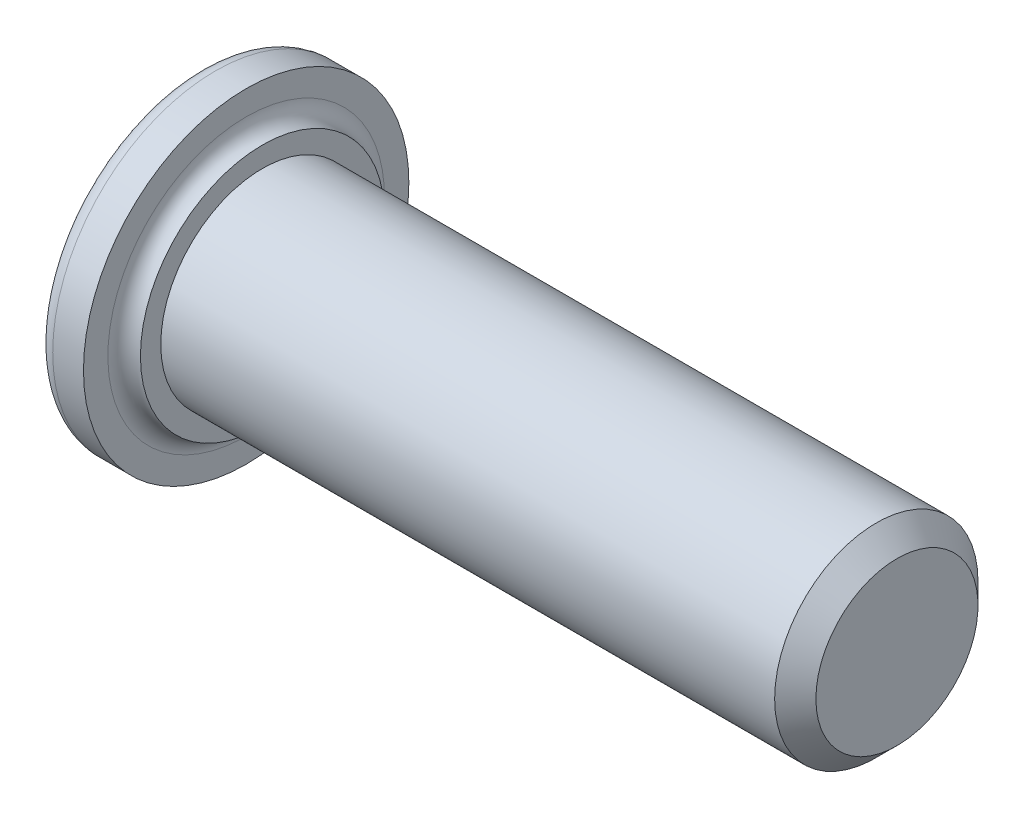
ISO-10303-21;
HEADER;
FILE_DESCRIPTION(('STEP AP214'),'2;1');
FILE_NAME('part.step','',(''),(''),'','','');
FILE_SCHEMA(('AUTOMOTIVE_DESIGN { 1 0 10303 214 1 1 1 1 }'));
ENDSEC;
DATA;
#1=APPLICATION_CONTEXT('core data for automotive mechanical design processes');
#2=APPLICATION_PROTOCOL_DEFINITION('international standard','automotive_design',2000,#1);
#3=PRODUCT_CONTEXT('',#1,'mechanical');
#4=PRODUCT('Part','Part','',(#3));
#5=PRODUCT_RELATED_PRODUCT_CATEGORY('part','',(#4));
#6=PRODUCT_DEFINITION_FORMATION('','',#4);
#7=PRODUCT_DEFINITION_CONTEXT('part definition',#1,'design');
#8=PRODUCT_DEFINITION('design','',#6,#7);
#9=PRODUCT_DEFINITION_SHAPE('','',#8);
#10=(LENGTH_UNIT() NAMED_UNIT(*) SI_UNIT(.MILLI.,.METRE.));
#11=(NAMED_UNIT(*) PLANE_ANGLE_UNIT() SI_UNIT($,.RADIAN.));
#12=(NAMED_UNIT(*) SI_UNIT($,.STERADIAN.) SOLID_ANGLE_UNIT());
#13=UNCERTAINTY_MEASURE_WITH_UNIT(LENGTH_MEASURE(1.E-05),#10,'distance_accuracy_value','');
#14=(GEOMETRIC_REPRESENTATION_CONTEXT(3) GLOBAL_UNCERTAINTY_ASSIGNED_CONTEXT((#13)) GLOBAL_UNIT_ASSIGNED_CONTEXT((#10,
#11,#12)) REPRESENTATION_CONTEXT('',''));
#15=CARTESIAN_POINT('',(0.,0.,0.));
#16=DIRECTION('',(0.,0.,1.));
#17=DIRECTION('',(1.,0.,0.));
#18=AXIS2_PLACEMENT_3D('',#15,#16,#17);
#19=CARTESIAN_POINT('',(-8.,0.,0.));
#20=DIRECTION('',(-1.,0.,0.));
#21=DIRECTION('',(0.,0.,1.));
#22=AXIS2_PLACEMENT_3D('',#19,#20,#21);
#23=PLANE('',#22);
#24=CARTESIAN_POINT('',(-8.,0.,0.));
#25=DIRECTION('',(-1.,0.,0.));
#26=DIRECTION('',(0.,0.,1.));
#27=AXIS2_PLACEMENT_3D('',#24,#25,#26);
#28=CIRCLE('',#27,0.494974746830583);
#29=CARTESIAN_POINT('',(-8.,0.35,0.349999999999998));
#30=VERTEX_POINT('',#29);
#31=CARTESIAN_POINT('',(-8.,0.349999999999998,-0.350000000000001));
#32=VERTEX_POINT('',#31);
#33=EDGE_CURVE('E180',#30,#32,#28,.T.);
#34=ORIENTED_EDGE('',*,*,#33,.F.);
#35=DIRECTION('',(0.,-0.707106781186546,0.707106781186549));
#36=VECTOR('',#35,1.);
#37=CARTESIAN_POINT('',(-8.,0.449999999999998,0.25));
#38=LINE('',#37,#36);
#39=CARTESIAN_POINT('',(-8.,0.449999999999998,0.25));
#40=VERTEX_POINT('',#39);
#41=EDGE_CURVE('E215',#30,#40,#38,.F.);
#42=ORIENTED_EDGE('',*,*,#41,.T.);
#43=DIRECTION('',(0.,1.,0.));
#44=VECTOR('',#43,1.);
#45=CARTESIAN_POINT('',(-8.,1.25,0.25));
#46=LINE('',#45,#44);
#47=CARTESIAN_POINT('',(-8.,1.25,0.25));
#48=VERTEX_POINT('',#47);
#49=EDGE_CURVE('E188',#40,#48,#46,.T.);
#50=ORIENTED_EDGE('',*,*,#49,.T.);
#51=DIRECTION('',(0.,0.,-1.));
#52=VECTOR('',#51,1.);
#53=CARTESIAN_POINT('',(-8.,1.25,-0.25));
#54=LINE('',#53,#52);
#55=CARTESIAN_POINT('',(-8.,1.25,-0.25));
#56=VERTEX_POINT('',#55);
#57=EDGE_CURVE('E437',#48,#56,#54,.T.);
#58=ORIENTED_EDGE('',*,*,#57,.T.);
#59=DIRECTION('',(0.,-1.,0.));
#60=VECTOR('',#59,1.);
#61=CARTESIAN_POINT('',(-8.,1.25,-0.25));
#62=LINE('',#61,#60);
#63=CARTESIAN_POINT('',(-8.,0.45,-0.25));
#64=VERTEX_POINT('',#63);
#65=EDGE_CURVE('E213',#56,#64,#62,.T.);
#66=ORIENTED_EDGE('',*,*,#65,.T.);
#67=DIRECTION('',(0.,0.707106781186551,0.707106781186544));
#68=VECTOR('',#67,1.);
#69=CARTESIAN_POINT('',(-8.,0.249999999999999,-0.449999999999999));
#70=LINE('',#69,#68);
#71=EDGE_CURVE('E205',#64,#32,#70,.F.);
#72=ORIENTED_EDGE('',*,*,#71,.T.);
#73=EDGE_LOOP('',(#34,#42,#50,#58,#66,#72));
#74=FACE_BOUND('',#73,.T.);
#75=ADVANCED_FACE('F45',(#74),#23,.T.);
#76=CARTESIAN_POINT('',(-8.,-0.35,-0.349999999999999));
#77=VERTEX_POINT('',#76);
#78=EDGE_CURVE('E182',#32,#77,#28,.T.);
#79=ORIENTED_EDGE('',*,*,#78,.F.);
#80=CARTESIAN_POINT('',(-8.,0.249999999999999,-0.449999999999999));
#81=VERTEX_POINT('',#80);
#82=EDGE_CURVE('E194',#32,#81,#70,.F.);
#83=ORIENTED_EDGE('',*,*,#82,.T.);
#84=DIRECTION('',(0.,0.,-1.));
#85=VECTOR('',#84,1.);
#86=CARTESIAN_POINT('',(-8.,0.249999999999999,-1.25));
#87=LINE('',#86,#85);
#88=CARTESIAN_POINT('',(-8.,0.249999999999999,-1.25));
#89=VERTEX_POINT('',#88);
#90=EDGE_CURVE('E432',#81,#89,#87,.T.);
#91=ORIENTED_EDGE('',*,*,#90,.T.);
#92=DIRECTION('',(0.,-1.,0.));
#93=VECTOR('',#92,1.);
#94=CARTESIAN_POINT('',(-8.,-0.250000000000001,-1.25));
#95=LINE('',#94,#93);
#96=CARTESIAN_POINT('',(-8.,-0.250000000000001,-1.25));
#97=VERTEX_POINT('',#96);
#98=EDGE_CURVE('E428',#89,#97,#95,.T.);
#99=ORIENTED_EDGE('',*,*,#98,.T.);
#100=DIRECTION('',(0.,0.,1.));
#101=VECTOR('',#100,1.);
#102=CARTESIAN_POINT('',(-8.,-0.250000000000002,-0.25));
#103=LINE('',#102,#101);
#104=CARTESIAN_POINT('',(-8.,-0.250000000000001,-0.449999999999998));
#105=VERTEX_POINT('',#104);
#106=EDGE_CURVE('E425',#97,#105,#103,.T.);
#107=ORIENTED_EDGE('',*,*,#106,.T.);
#108=DIRECTION('',(0.,0.707106781186546,-0.707106781186549));
#109=VECTOR('',#108,1.);
#110=CARTESIAN_POINT('',(-8.,-0.449999999999999,-0.25));
#111=LINE('',#110,#109);
#112=EDGE_CURVE('E198',#105,#77,#111,.F.);
#113=ORIENTED_EDGE('',*,*,#112,.T.);
#114=EDGE_LOOP('',(#79,#83,#91,#99,#107,#113));
#115=FACE_BOUND('',#114,.T.);
#116=ADVANCED_FACE('F193',(#115),#23,.T.);
#117=CARTESIAN_POINT('',(-8.,-0.350000000000002,0.350000000000001));
#118=VERTEX_POINT('',#117);
#119=EDGE_CURVE('E61',#77,#118,#28,.T.);
#120=ORIENTED_EDGE('',*,*,#119,.F.);
#121=CARTESIAN_POINT('',(-8.,-0.449999999999999,-0.25));
#122=VERTEX_POINT('',#121);
#123=EDGE_CURVE('E278',#77,#122,#111,.F.);
#124=ORIENTED_EDGE('',*,*,#123,.T.);
#125=DIRECTION('',(0.,-1.,0.));
#126=VECTOR('',#125,1.);
#127=CARTESIAN_POINT('',(-8.,-1.25,-0.25));
#128=LINE('',#127,#126);
#129=CARTESIAN_POINT('',(-8.,-1.25,-0.25));
#130=VERTEX_POINT('',#129);
#131=EDGE_CURVE('E422',#122,#130,#128,.T.);
#132=ORIENTED_EDGE('',*,*,#131,.T.);
#133=DIRECTION('',(0.,0.,1.));
#134=VECTOR('',#133,1.);
#135=CARTESIAN_POINT('',(-8.,-1.25,0.25));
#136=LINE('',#135,#134);
#137=CARTESIAN_POINT('',(-8.,-1.25,0.25));
#138=VERTEX_POINT('',#137);
#139=EDGE_CURVE('E418',#130,#138,#136,.T.);
#140=ORIENTED_EDGE('',*,*,#139,.T.);
#141=DIRECTION('',(0.,1.,0.));
#142=VECTOR('',#141,1.);
#143=CARTESIAN_POINT('',(-8.,-0.250000000000001,0.25));
#144=LINE('',#143,#142);
#145=CARTESIAN_POINT('',(-8.,-0.450000000000003,0.25));
#146=VERTEX_POINT('',#145);
#147=EDGE_CURVE('E415',#138,#146,#144,.T.);
#148=ORIENTED_EDGE('',*,*,#147,.T.);
#149=DIRECTION('',(0.,-0.707106781186547,-0.707106781186548));
#150=VECTOR('',#149,1.);
#151=CARTESIAN_POINT('',(-8.,-0.250000000000001,0.450000000000002));
#152=LINE('',#151,#150);
#153=EDGE_CURVE('E282',#146,#118,#152,.F.);
#154=ORIENTED_EDGE('',*,*,#153,.T.);
#155=EDGE_LOOP('',(#120,#124,#132,#140,#148,#154));
#156=FACE_BOUND('',#155,.T.);
#157=ADVANCED_FACE('F252',(#156),#23,.T.);
#158=CARTESIAN_POINT('',(-4.75000000000001,0.,0.));
#159=DIRECTION('',(1.,0.,0.));
#160=DIRECTION('',(0.,1.,0.));
#161=AXIS2_PLACEMENT_3D('',#158,#159,#160);
#162=SPHERICAL_SURFACE('',#161,4.24999999999999);
#163=CARTESIAN_POINT('',(-8.55717727002987,0.,0.));
#164=DIRECTION('',(1.,0.,0.));
#165=DIRECTION('',(0.,1.,0.));
#166=AXIS2_PLACEMENT_3D('',#163,#164,#165);
#167=CIRCLE('',#166,1.88888888888889);
#168=CARTESIAN_POINT('',(-8.55717727002987,1.88888888888889,0.));
#169=VERTEX_POINT('',#168);
#170=EDGE_CURVE('E11',#169,#169,#167,.F.);
#171=ORIENTED_EDGE('',*,*,#170,.T.);
#172=EDGE_LOOP('',(#171));
#173=FACE_BOUND('',#172,.T.);
#174=CARTESIAN_POINT('',(-4.75000000000001,-0.250000000000001,0.));
#175=DIRECTION('',(0.,-1.,0.));
#176=DIRECTION('',(0.,0.,-1.));
#177=AXIS2_PLACEMENT_3D('',#174,#175,#176);
#178=CIRCLE('',#177,4.24264068711928);
#179=CARTESIAN_POINT('',(-8.96870833312757,-0.250000000000002,0.450000000000002));
#180=VERTEX_POINT('',#179);
#181=CARTESIAN_POINT('',(-8.80431868505671,-0.250000000000001,1.25));
#182=VERTEX_POINT('',#181);
#183=EDGE_CURVE('E339',#180,#182,#178,.F.);
#184=ORIENTED_EDGE('',*,*,#183,.F.);
#185=CARTESIAN_POINT('',(-4.75000000000001,-0.350000000000002,0.350000000000001));
#186=DIRECTION('',(0.,-0.707106781186548,0.707106781186547));
#187=DIRECTION('',(0.,-0.707106781186547,-0.707106781186548));
#188=AXIS2_PLACEMENT_3D('',#185,#186,#187);
#189=CIRCLE('',#188,4.22107806134878);
#190=CARTESIAN_POINT('',(-8.96870833312757,-0.450000000000003,0.25));
#191=VERTEX_POINT('',#190);
#192=EDGE_CURVE('E314',#180,#191,#189,.T.);
#193=ORIENTED_EDGE('',*,*,#192,.T.);
#194=CARTESIAN_POINT('',(-4.75000000000001,0.,0.25));
#195=DIRECTION('',(0.,0.,1.));
#196=DIRECTION('',(0.,-1.,0.));
#197=AXIS2_PLACEMENT_3D('',#194,#195,#196);
#198=CIRCLE('',#197,4.24264068711928);
#199=CARTESIAN_POINT('',(-8.80431868505671,-1.25,0.25));
#200=VERTEX_POINT('',#199);
#201=EDGE_CURVE('E342',#200,#191,#198,.F.);
#202=ORIENTED_EDGE('',*,*,#201,.F.);
#203=CARTESIAN_POINT('',(-4.75000000000001,-1.25,0.));
#204=DIRECTION('',(0.,-1.,0.));
#205=DIRECTION('',(1.,0.,0.));
#206=AXIS2_PLACEMENT_3D('',#203,#204,#205);
#207=CIRCLE('',#206,4.06201920231797);
#208=CARTESIAN_POINT('',(-8.80431868505671,-1.25,-0.25));
#209=VERTEX_POINT('',#208);
#210=EDGE_CURVE('E346',#209,#200,#207,.F.);
#211=ORIENTED_EDGE('',*,*,#210,.F.);
#212=CARTESIAN_POINT('',(-4.75000000000001,0.,-0.25));
#213=DIRECTION('',(0.,0.,-1.));
#214=DIRECTION('',(0.,1.,0.));
#215=AXIS2_PLACEMENT_3D('',#212,#213,#214);
#216=CIRCLE('',#215,4.24264068711928);
#217=CARTESIAN_POINT('',(-8.96870833312757,-0.449999999999999,-0.25));
#218=VERTEX_POINT('',#217);
#219=EDGE_CURVE('E349',#218,#209,#216,.F.);
#220=ORIENTED_EDGE('',*,*,#219,.F.);
#221=CARTESIAN_POINT('',(-4.75000000000001,-0.35,-0.349999999999998));
#222=DIRECTION('',(0.,-0.707106781186549,-0.707106781186546));
#223=DIRECTION('',(0.,0.707106781186546,-0.707106781186549));
#224=AXIS2_PLACEMENT_3D('',#221,#222,#223);
#225=CIRCLE('',#224,4.22107806134878);
#226=CARTESIAN_POINT('',(-8.96870833312757,-0.250000000000002,-0.449999999999998));
#227=VERTEX_POINT('',#226);
#228=EDGE_CURVE('E317',#218,#227,#225,.T.);
#229=ORIENTED_EDGE('',*,*,#228,.T.);
#230=CARTESIAN_POINT('',(-4.75000000000001,-0.250000000000001,0.));
#231=DIRECTION('',(0.,-1.,0.));
#232=DIRECTION('',(0.,0.,-1.));
#233=AXIS2_PLACEMENT_3D('',#230,#231,#232);
#234=CIRCLE('',#233,4.24264068711928);
#235=CARTESIAN_POINT('',(-8.80431868505671,-0.250000000000001,-1.25));
#236=VERTEX_POINT('',#235);
#237=EDGE_CURVE('E352',#236,#227,#234,.F.);
#238=ORIENTED_EDGE('',*,*,#237,.F.);
#239=CARTESIAN_POINT('',(-4.75000000000001,0.,-1.25));
#240=DIRECTION('',(0.,0.,-1.));
#241=DIRECTION('',(-1.,0.,0.));
#242=AXIS2_PLACEMENT_3D('',#239,#240,#241);
#243=CIRCLE('',#242,4.06201920231797);
#244=CARTESIAN_POINT('',(-8.80431868505671,0.249999999999999,-1.25));
#245=VERTEX_POINT('',#244);
#246=EDGE_CURVE('E356',#245,#236,#243,.F.);
#247=ORIENTED_EDGE('',*,*,#246,.F.);
#248=CARTESIAN_POINT('',(-4.75000000000001,0.249999999999999,0.));
#249=DIRECTION('',(0.,1.,0.));
#250=DIRECTION('',(0.,0.,1.));
#251=AXIS2_PLACEMENT_3D('',#248,#249,#250);
#252=CIRCLE('',#251,4.24264068711928);
#253=CARTESIAN_POINT('',(-8.96870833312757,0.249999999999999,-0.45));
#254=VERTEX_POINT('',#253);
#255=EDGE_CURVE('E359',#254,#245,#252,.F.);
#256=ORIENTED_EDGE('',*,*,#255,.F.);
#257=CARTESIAN_POINT('',(-4.75000000000001,0.349999999999998,-0.350000000000002));
#258=DIRECTION('',(0.,0.707106781186544,-0.707106781186551));
#259=DIRECTION('',(0.,0.707106781186551,0.707106781186544));
#260=AXIS2_PLACEMENT_3D('',#257,#258,#259);
#261=CIRCLE('',#260,4.22107806134878);
#262=CARTESIAN_POINT('',(-8.96870833312757,0.45,-0.25));
#263=VERTEX_POINT('',#262);
#264=EDGE_CURVE('E320',#254,#263,#261,.T.);
#265=ORIENTED_EDGE('',*,*,#264,.T.);
#266=CARTESIAN_POINT('',(-4.75000000000001,0.,-0.25));
#267=DIRECTION('',(0.,0.,-1.));
#268=DIRECTION('',(0.,1.,0.));
#269=AXIS2_PLACEMENT_3D('',#266,#267,#268);
#270=CIRCLE('',#269,4.24264068711928);
#271=CARTESIAN_POINT('',(-8.80431868505671,1.25,-0.25));
#272=VERTEX_POINT('',#271);
#273=EDGE_CURVE('E362',#272,#263,#270,.F.);
#274=ORIENTED_EDGE('',*,*,#273,.F.);
#275=CARTESIAN_POINT('',(-4.75000000000001,1.25,0.));
#276=DIRECTION('',(0.,1.,0.));
#277=DIRECTION('',(-1.,0.,0.));
#278=AXIS2_PLACEMENT_3D('',#275,#276,#277);
#279=CIRCLE('',#278,4.06201920231797);
#280=CARTESIAN_POINT('',(-8.80431868505671,1.25,0.25));
#281=VERTEX_POINT('',#280);
#282=EDGE_CURVE('E366',#281,#272,#279,.F.);
#283=ORIENTED_EDGE('',*,*,#282,.F.);
#284=CARTESIAN_POINT('',(-4.75000000000001,0.,0.25));
#285=DIRECTION('',(0.,0.,1.));
#286=DIRECTION('',(0.,-1.,0.));
#287=AXIS2_PLACEMENT_3D('',#284,#285,#286);
#288=CIRCLE('',#287,4.24264068711928);
#289=CARTESIAN_POINT('',(-8.96870833312757,0.449999999999998,0.25));
#290=VERTEX_POINT('',#289);
#291=EDGE_CURVE('E330',#290,#281,#288,.F.);
#292=ORIENTED_EDGE('',*,*,#291,.F.);
#293=CARTESIAN_POINT('',(-4.75000000000001,0.35,0.349999999999999));
#294=DIRECTION('',(0.,0.707106781186549,0.707106781186546));
#295=DIRECTION('',(0.,-0.707106781186546,0.707106781186549));
#296=AXIS2_PLACEMENT_3D('',#293,#294,#295);
#297=CIRCLE('',#296,4.22107806134878);
#298=CARTESIAN_POINT('',(-8.96870833312757,0.249999999999999,0.45));
#299=VERTEX_POINT('',#298);
#300=EDGE_CURVE('E323',#290,#299,#297,.T.);
#301=ORIENTED_EDGE('',*,*,#300,.T.);
#302=CARTESIAN_POINT('',(-4.75000000000001,0.249999999999999,0.));
#303=DIRECTION('',(0.,1.,0.));
#304=DIRECTION('',(-1.,0.,0.));
#305=AXIS2_PLACEMENT_3D('',#302,#303,#304);
#306=CIRCLE('',#305,4.24264068711928);
#307=CARTESIAN_POINT('',(-8.80431868505671,0.249999999999999,1.25));
#308=VERTEX_POINT('',#307);
#309=EDGE_CURVE('E333',#308,#299,#306,.F.);
#310=ORIENTED_EDGE('',*,*,#309,.F.);
#311=CARTESIAN_POINT('',(-4.75000000000001,0.,1.25));
#312=DIRECTION('',(0.,0.,1.));
#313=DIRECTION('',(1.,0.,0.));
#314=AXIS2_PLACEMENT_3D('',#311,#312,#313);
#315=CIRCLE('',#314,4.06201920231797);
#316=EDGE_CURVE('E336',#182,#308,#315,.F.);
#317=ORIENTED_EDGE('',*,*,#316,.F.);
#318=EDGE_LOOP('',(#184,#193,#202,#211,#220,#229,#238,#247,#256,#265,#274,#283,#292,#301,#310,#317));
#319=FACE_BOUND('',#318,.T.);
#320=ADVANCED_FACE('F269',(#173,#319),#162,.T.);
#321=CARTESIAN_POINT('',(0.,0.,0.));
#322=DIRECTION('',(1.,0.,0.));
#323=DIRECTION('',(0.,1.,0.));
#324=AXIS2_PLACEMENT_3D('',#321,#322,#323);
#325=CYLINDRICAL_SURFACE('',#324,2.);
#326=CARTESIAN_POINT('',(-8.37801598673435,0.,0.));
#327=DIRECTION('',(1.,0.,0.));
#328=DIRECTION('',(0.,1.,0.));
#329=AXIS2_PLACEMENT_3D('',#326,#327,#328);
#330=CIRCLE('',#329,2.);
#331=CARTESIAN_POINT('',(-8.37801598673435,2.,0.));
#332=VERTEX_POINT('',#331);
#333=EDGE_CURVE('E54',#332,#332,#330,.T.);
#334=ORIENTED_EDGE('',*,*,#333,.T.);
#335=EDGE_LOOP('',(#334));
#336=FACE_BOUND('',#335,.T.);
#337=CARTESIAN_POINT('',(-8.,0.,0.));
#338=DIRECTION('',(1.,0.,0.));
#339=DIRECTION('',(0.,1.,0.));
#340=AXIS2_PLACEMENT_3D('',#337,#338,#339);
#341=CIRCLE('',#340,2.);
#342=CARTESIAN_POINT('',(-8.,2.,0.));
#343=VERTEX_POINT('',#342);
#344=EDGE_CURVE('E369',#343,#343,#341,.T.);
#345=ORIENTED_EDGE('',*,*,#344,.F.);
#346=EDGE_LOOP('',(#345));
#347=FACE_BOUND('',#346,.T.);
#348=ADVANCED_FACE('F231',(#336,#347),#325,.T.);
#349=CARTESIAN_POINT('',(-8.,2.,0.));
#350=DIRECTION('',(1.,0.,0.));
#351=DIRECTION('',(0.,1.,0.));
#352=AXIS2_PLACEMENT_3D('',#349,#350,#351);
#353=PLANE('',#352);
#354=CARTESIAN_POINT('',(-8.,0.,0.));
#355=DIRECTION('',(1.,0.,0.));
#356=DIRECTION('',(0.,1.,0.));
#357=AXIS2_PLACEMENT_3D('',#354,#355,#356);
#358=CIRCLE('',#357,1.7);
#359=CARTESIAN_POINT('',(-8.,1.7,0.));
#360=VERTEX_POINT('',#359);
#361=EDGE_CURVE('E224',#360,#360,#358,.F.);
#362=ORIENTED_EDGE('',*,*,#361,.T.);
#363=EDGE_LOOP('',(#362));
#364=FACE_BOUND('',#363,.T.);
#365=ORIENTED_EDGE('',*,*,#344,.T.);
#366=EDGE_LOOP('',(#365));
#367=FACE_BOUND('',#366,.T.);
#368=ADVANCED_FACE('F567',(#364,#367),#353,.T.);
#369=CARTESIAN_POINT('',(-8.,1.25,0.25));
#370=DIRECTION('',(0.,0.,1.));
#371=DIRECTION('',(0.,-1.,0.));
#372=AXIS2_PLACEMENT_3D('',#369,#370,#371);
#373=PLANE('',#372);
#374=ORIENTED_EDGE('',*,*,#49,.F.);
#375=DIRECTION('',(-1.,0.,0.));
#376=VECTOR('',#375,1.);
#377=CARTESIAN_POINT('',(-8.,0.449999999999998,0.25));
#378=LINE('',#377,#376);
#379=EDGE_CURVE('E297',#40,#290,#378,.T.);
#380=ORIENTED_EDGE('',*,*,#379,.T.);
#381=ORIENTED_EDGE('',*,*,#291,.T.);
#382=DIRECTION('',(-1.,0.,0.));
#383=VECTOR('',#382,1.);
#384=CARTESIAN_POINT('',(-8.,1.25,0.25));
#385=LINE('',#384,#383);
#386=EDGE_CURVE('E374',#48,#281,#385,.T.);
#387=ORIENTED_EDGE('',*,*,#386,.F.);
#388=EDGE_LOOP('',(#374,#380,#381,#387));
#389=FACE_BOUND('',#388,.T.);
#390=ADVANCED_FACE('F507',(#389),#373,.F.);
#391=CARTESIAN_POINT('',(-8.,0.249999999999999,0.25));
#392=DIRECTION('',(0.,1.,0.));
#393=DIRECTION('',(-1.,0.,0.));
#394=AXIS2_PLACEMENT_3D('',#391,#392,#393);
#395=PLANE('',#394);
#396=ORIENTED_EDGE('',*,*,#309,.T.);
#397=DIRECTION('',(1.,0.,0.));
#398=VECTOR('',#397,1.);
#399=CARTESIAN_POINT('',(-8.,0.249999999999999,0.45));
#400=LINE('',#399,#398);
#401=CARTESIAN_POINT('',(-8.,0.249999999999999,0.45));
#402=VERTEX_POINT('',#401);
#403=EDGE_CURVE('E69',#299,#402,#400,.T.);
#404=ORIENTED_EDGE('',*,*,#403,.T.);
#405=DIRECTION('',(0.,0.,-1.));
#406=VECTOR('',#405,1.);
#407=CARTESIAN_POINT('',(-8.,0.249999999999999,0.25));
#408=LINE('',#407,#406);
#409=CARTESIAN_POINT('',(-8.,0.249999999999999,1.25));
#410=VERTEX_POINT('',#409);
#411=EDGE_CURVE('E379',#410,#402,#408,.T.);
#412=ORIENTED_EDGE('',*,*,#411,.F.);
#413=DIRECTION('',(-1.,0.,0.));
#414=VECTOR('',#413,1.);
#415=CARTESIAN_POINT('',(-8.,0.249999999999999,1.25));
#416=LINE('',#415,#414);
#417=EDGE_CURVE('E373',#410,#308,#416,.T.);
#418=ORIENTED_EDGE('',*,*,#417,.T.);
#419=EDGE_LOOP('',(#396,#404,#412,#418));
#420=FACE_BOUND('',#419,.T.);
#421=ADVANCED_FACE('F497',(#420),#395,.F.);
#422=CARTESIAN_POINT('',(-8.,0.249999999999999,1.25));
#423=DIRECTION('',(0.,0.,1.));
#424=DIRECTION('',(1.,0.,0.));
#425=AXIS2_PLACEMENT_3D('',#422,#423,#424);
#426=PLANE('',#425);
#427=ORIENTED_EDGE('',*,*,#316,.T.);
#428=ORIENTED_EDGE('',*,*,#417,.F.);
#429=DIRECTION('',(0.,1.,0.));
#430=VECTOR('',#429,1.);
#431=CARTESIAN_POINT('',(-8.,0.249999999999999,1.25));
#432=LINE('',#431,#430);
#433=CARTESIAN_POINT('',(-8.,-0.250000000000001,1.25));
#434=VERTEX_POINT('',#433);
#435=EDGE_CURVE('E408',#434,#410,#432,.T.);
#436=ORIENTED_EDGE('',*,*,#435,.F.);
#437=DIRECTION('',(-1.,0.,0.));
#438=VECTOR('',#437,1.);
#439=CARTESIAN_POINT('',(-8.,-0.250000000000001,1.25));
#440=LINE('',#439,#438);
#441=EDGE_CURVE('E399',#434,#182,#440,.T.);
#442=ORIENTED_EDGE('',*,*,#441,.T.);
#443=EDGE_LOOP('',(#427,#428,#436,#442));
#444=FACE_BOUND('',#443,.T.);
#445=ADVANCED_FACE('F542',(#444),#426,.F.);
#446=CARTESIAN_POINT('',(-8.,-0.250000000000001,1.25));
#447=DIRECTION('',(0.,-1.,0.));
#448=DIRECTION('',(0.,0.,-1.));
#449=AXIS2_PLACEMENT_3D('',#446,#447,#448);
#450=PLANE('',#449);
#451=DIRECTION('',(0.,0.,1.));
#452=VECTOR('',#451,1.);
#453=CARTESIAN_POINT('',(-8.,-0.250000000000001,1.25));
#454=LINE('',#453,#452);
#455=CARTESIAN_POINT('',(-8.,-0.250000000000001,0.450000000000002));
#456=VERTEX_POINT('',#455);
#457=EDGE_CURVE('E412',#456,#434,#454,.T.);
#458=ORIENTED_EDGE('',*,*,#457,.F.);
#459=DIRECTION('',(-1.,0.,0.));
#460=VECTOR('',#459,1.);
#461=CARTESIAN_POINT('',(-8.,-0.250000000000001,0.450000000000002));
#462=LINE('',#461,#460);
#463=EDGE_CURVE('E326',#456,#180,#462,.T.);
#464=ORIENTED_EDGE('',*,*,#463,.T.);
#465=ORIENTED_EDGE('',*,*,#183,.T.);
#466=ORIENTED_EDGE('',*,*,#441,.F.);
#467=EDGE_LOOP('',(#458,#464,#465,#466));
#468=FACE_BOUND('',#467,.T.);
#469=ADVANCED_FACE('F541',(#468),#450,.F.);
#470=CARTESIAN_POINT('',(-8.,-0.250000000000001,0.25));
#471=DIRECTION('',(0.,0.,1.));
#472=DIRECTION('',(0.,-1.,0.));
#473=AXIS2_PLACEMENT_3D('',#470,#471,#472);
#474=PLANE('',#473);
#475=ORIENTED_EDGE('',*,*,#201,.T.);
#476=DIRECTION('',(1.,0.,0.));
#477=VECTOR('',#476,1.);
#478=CARTESIAN_POINT('',(-8.,-0.450000000000003,0.25));
#479=LINE('',#478,#477);
#480=EDGE_CURVE('E311',#191,#146,#479,.T.);
#481=ORIENTED_EDGE('',*,*,#480,.T.);
#482=ORIENTED_EDGE('',*,*,#147,.F.);
#483=DIRECTION('',(-1.,0.,0.));
#484=VECTOR('',#483,1.);
#485=CARTESIAN_POINT('',(-8.,-1.25,0.25));
#486=LINE('',#485,#484);
#487=EDGE_CURVE('E395',#138,#200,#486,.T.);
#488=ORIENTED_EDGE('',*,*,#487,.T.);
#489=EDGE_LOOP('',(#475,#481,#482,#488));
#490=FACE_BOUND('',#489,.T.);
#491=ADVANCED_FACE('F535',(#490),#474,.F.);
#492=CARTESIAN_POINT('',(-8.,-1.25,0.25));
#493=DIRECTION('',(0.,-1.,0.));
#494=DIRECTION('',(1.,0.,0.));
#495=AXIS2_PLACEMENT_3D('',#492,#493,#494);
#496=PLANE('',#495);
#497=ORIENTED_EDGE('',*,*,#210,.T.);
#498=ORIENTED_EDGE('',*,*,#487,.F.);
#499=ORIENTED_EDGE('',*,*,#139,.F.);
#500=DIRECTION('',(-1.,0.,0.));
#501=VECTOR('',#500,1.);
#502=CARTESIAN_POINT('',(-8.,-1.25,-0.25));
#503=LINE('',#502,#501);
#504=EDGE_CURVE('E391',#130,#209,#503,.T.);
#505=ORIENTED_EDGE('',*,*,#504,.T.);
#506=EDGE_LOOP('',(#497,#498,#499,#505));
#507=FACE_BOUND('',#506,.T.);
#508=ADVANCED_FACE('F531',(#507),#496,.F.);
#509=CARTESIAN_POINT('',(-8.,-1.25,-0.25));
#510=DIRECTION('',(0.,0.,-1.));
#511=DIRECTION('',(0.,1.,0.));
#512=AXIS2_PLACEMENT_3D('',#509,#510,#511);
#513=PLANE('',#512);
#514=ORIENTED_EDGE('',*,*,#131,.F.);
#515=DIRECTION('',(-1.,0.,0.));
#516=VECTOR('',#515,1.);
#517=CARTESIAN_POINT('',(-8.,-0.449999999999999,-0.25));
#518=LINE('',#517,#516);
#519=EDGE_CURVE('E288',#122,#218,#518,.T.);
#520=ORIENTED_EDGE('',*,*,#519,.T.);
#521=ORIENTED_EDGE('',*,*,#219,.T.);
#522=ORIENTED_EDGE('',*,*,#504,.F.);
#523=EDGE_LOOP('',(#514,#520,#521,#522));
#524=FACE_BOUND('',#523,.T.);
#525=ADVANCED_FACE('F526',(#524),#513,.F.);
#526=CARTESIAN_POINT('',(-8.,-0.250000000000002,-0.25));
#527=DIRECTION('',(0.,-1.,0.));
#528=DIRECTION('',(0.,0.,-1.));
#529=AXIS2_PLACEMENT_3D('',#526,#527,#528);
#530=PLANE('',#529);
#531=ORIENTED_EDGE('',*,*,#237,.T.);
#532=DIRECTION('',(1.,0.,0.));
#533=VECTOR('',#532,1.);
#534=CARTESIAN_POINT('',(-8.,-0.250000000000001,-0.449999999999998));
#535=LINE('',#534,#533);
#536=EDGE_CURVE('E306',#227,#105,#535,.T.);
#537=ORIENTED_EDGE('',*,*,#536,.T.);
#538=ORIENTED_EDGE('',*,*,#106,.F.);
#539=DIRECTION('',(-1.,0.,0.));
#540=VECTOR('',#539,1.);
#541=CARTESIAN_POINT('',(-8.,-0.250000000000001,-1.25));
#542=LINE('',#541,#540);
#543=EDGE_CURVE('E387',#97,#236,#542,.T.);
#544=ORIENTED_EDGE('',*,*,#543,.T.);
#545=EDGE_LOOP('',(#531,#537,#538,#544));
#546=FACE_BOUND('',#545,.T.);
#547=ADVANCED_FACE('F523',(#546),#530,.F.);
#548=CARTESIAN_POINT('',(-8.,-0.250000000000001,-1.25));
#549=DIRECTION('',(0.,0.,-1.));
#550=DIRECTION('',(-1.,0.,0.));
#551=AXIS2_PLACEMENT_3D('',#548,#549,#550);
#552=PLANE('',#551);
#553=ORIENTED_EDGE('',*,*,#246,.T.);
#554=ORIENTED_EDGE('',*,*,#543,.F.);
#555=ORIENTED_EDGE('',*,*,#98,.F.);
#556=DIRECTION('',(-1.,0.,0.));
#557=VECTOR('',#556,1.);
#558=CARTESIAN_POINT('',(-8.,0.249999999999999,-1.25));
#559=LINE('',#558,#557);
#560=EDGE_CURVE('E383',#89,#245,#559,.T.);
#561=ORIENTED_EDGE('',*,*,#560,.T.);
#562=EDGE_LOOP('',(#553,#554,#555,#561));
#563=FACE_BOUND('',#562,.T.);
#564=ADVANCED_FACE('F519',(#563),#552,.F.);
#565=CARTESIAN_POINT('',(-8.,0.249999999999999,-1.25));
#566=DIRECTION('',(0.,1.,0.));
#567=DIRECTION('',(0.,0.,1.));
#568=AXIS2_PLACEMENT_3D('',#565,#566,#567);
#569=PLANE('',#568);
#570=ORIENTED_EDGE('',*,*,#90,.F.);
#571=DIRECTION('',(-1.,0.,0.));
#572=VECTOR('',#571,1.);
#573=CARTESIAN_POINT('',(-8.,0.249999999999999,-0.449999999999999));
#574=LINE('',#573,#572);
#575=EDGE_CURVE('E207',#81,#254,#574,.T.);
#576=ORIENTED_EDGE('',*,*,#575,.T.);
#577=ORIENTED_EDGE('',*,*,#255,.T.);
#578=ORIENTED_EDGE('',*,*,#560,.F.);
#579=EDGE_LOOP('',(#570,#576,#577,#578));
#580=FACE_BOUND('',#579,.T.);
#581=ADVANCED_FACE('F514',(#580),#569,.F.);
#582=CARTESIAN_POINT('',(-8.,1.25,-0.25));
#583=DIRECTION('',(0.,0.,-1.));
#584=DIRECTION('',(0.,1.,0.));
#585=AXIS2_PLACEMENT_3D('',#582,#583,#584);
#586=PLANE('',#585);
#587=ORIENTED_EDGE('',*,*,#273,.T.);
#588=DIRECTION('',(1.,0.,0.));
#589=VECTOR('',#588,1.);
#590=CARTESIAN_POINT('',(-8.,0.45,-0.25));
#591=LINE('',#590,#589);
#592=EDGE_CURVE('E301',#263,#64,#591,.T.);
#593=ORIENTED_EDGE('',*,*,#592,.T.);
#594=ORIENTED_EDGE('',*,*,#65,.F.);
#595=DIRECTION('',(-1.,0.,0.));
#596=VECTOR('',#595,1.);
#597=CARTESIAN_POINT('',(-8.,1.25,-0.25));
#598=LINE('',#597,#596);
#599=EDGE_CURVE('E378',#56,#272,#598,.T.);
#600=ORIENTED_EDGE('',*,*,#599,.T.);
#601=EDGE_LOOP('',(#587,#593,#594,#600));
#602=FACE_BOUND('',#601,.T.);
#603=ADVANCED_FACE('F265',(#602),#586,.F.);
#604=CARTESIAN_POINT('',(-8.,1.25,-0.25));
#605=DIRECTION('',(0.,1.,0.));
#606=DIRECTION('',(-1.,0.,0.));
#607=AXIS2_PLACEMENT_3D('',#604,#605,#606);
#608=PLANE('',#607);
#609=ORIENTED_EDGE('',*,*,#282,.T.);
#610=ORIENTED_EDGE('',*,*,#599,.F.);
#611=ORIENTED_EDGE('',*,*,#57,.F.);
#612=ORIENTED_EDGE('',*,*,#386,.T.);
#613=EDGE_LOOP('',(#609,#610,#611,#612));
#614=FACE_BOUND('',#613,.T.);
#615=ADVANCED_FACE('F256',(#614),#608,.F.);
#616=EDGE_CURVE('E183',#118,#30,#28,.T.);
#617=ORIENTED_EDGE('',*,*,#616,.F.);
#618=EDGE_CURVE('E292',#118,#456,#152,.F.);
#619=ORIENTED_EDGE('',*,*,#618,.T.);
#620=ORIENTED_EDGE('',*,*,#457,.T.);
#621=ORIENTED_EDGE('',*,*,#435,.T.);
#622=ORIENTED_EDGE('',*,*,#411,.T.);
#623=EDGE_CURVE('E217',#402,#30,#38,.F.);
#624=ORIENTED_EDGE('',*,*,#623,.T.);
#625=EDGE_LOOP('',(#617,#619,#620,#621,#622,#624));
#626=FACE_BOUND('',#625,.T.);
#627=ADVANCED_FACE('F248',(#626),#23,.T.);
#628=CARTESIAN_POINT('',(-8.,-0.250000000000001,0.450000000000002));
#629=DIRECTION('',(0.,-0.707106781186548,0.707106781186547));
#630=DIRECTION('',(-1.,0.,0.));
#631=AXIS2_PLACEMENT_3D('',#628,#629,#630);
#632=PLANE('',#631);
#633=ORIENTED_EDGE('',*,*,#153,.F.);
#634=ORIENTED_EDGE('',*,*,#480,.F.);
#635=ORIENTED_EDGE('',*,*,#192,.F.);
#636=ORIENTED_EDGE('',*,*,#463,.F.);
#637=ORIENTED_EDGE('',*,*,#618,.F.);
#638=EDGE_LOOP('',(#633,#634,#635,#636,#637));
#639=FACE_BOUND('',#638,.T.);
#640=ADVANCED_FACE('F255',(#639),#632,.F.);
#641=CARTESIAN_POINT('',(-8.,-0.449999999999999,-0.25));
#642=DIRECTION('',(0.,-0.707106781186549,-0.707106781186546));
#643=DIRECTION('',(-1.,0.,0.));
#644=AXIS2_PLACEMENT_3D('',#641,#642,#643);
#645=PLANE('',#644);
#646=ORIENTED_EDGE('',*,*,#112,.F.);
#647=ORIENTED_EDGE('',*,*,#536,.F.);
#648=ORIENTED_EDGE('',*,*,#228,.F.);
#649=ORIENTED_EDGE('',*,*,#519,.F.);
#650=ORIENTED_EDGE('',*,*,#123,.F.);
#651=EDGE_LOOP('',(#646,#647,#648,#649,#650));
#652=FACE_BOUND('',#651,.T.);
#653=ADVANCED_FACE('F262',(#652),#645,.F.);
#654=CARTESIAN_POINT('',(-8.,0.249999999999999,-0.449999999999999));
#655=DIRECTION('',(0.,0.707106781186544,-0.707106781186551));
#656=DIRECTION('',(-1.,0.,0.));
#657=AXIS2_PLACEMENT_3D('',#654,#655,#656);
#658=PLANE('',#657);
#659=ORIENTED_EDGE('',*,*,#71,.F.);
#660=ORIENTED_EDGE('',*,*,#592,.F.);
#661=ORIENTED_EDGE('',*,*,#264,.F.);
#662=ORIENTED_EDGE('',*,*,#575,.F.);
#663=ORIENTED_EDGE('',*,*,#82,.F.);
#664=EDGE_LOOP('',(#659,#660,#661,#662,#663));
#665=FACE_BOUND('',#664,.T.);
#666=ADVANCED_FACE('F203',(#665),#658,.F.);
#667=CARTESIAN_POINT('',(-8.,0.449999999999998,0.25));
#668=DIRECTION('',(0.,0.707106781186549,0.707106781186546));
#669=DIRECTION('',(-1.,0.,0.));
#670=AXIS2_PLACEMENT_3D('',#667,#668,#669);
#671=PLANE('',#670);
#672=ORIENTED_EDGE('',*,*,#623,.F.);
#673=ORIENTED_EDGE('',*,*,#403,.F.);
#674=ORIENTED_EDGE('',*,*,#300,.F.);
#675=ORIENTED_EDGE('',*,*,#379,.F.);
#676=ORIENTED_EDGE('',*,*,#41,.F.);
#677=EDGE_LOOP('',(#672,#673,#674,#675,#676));
#678=FACE_BOUND('',#677,.T.);
#679=ADVANCED_FACE('F177',(#678),#671,.F.);
#680=CARTESIAN_POINT('',(-8.,0.,0.));
#681=DIRECTION('',(-1.,0.,0.));
#682=DIRECTION('',(0.,0.,1.));
#683=AXIS2_PLACEMENT_3D('',#680,#681,#682);
#684=CONICAL_SURFACE('',#683,0.494974746830583,1.48352986419518);
#685=CARTESIAN_POINT('',(-7.95669532092071,0.,0.));
#686=VERTEX_POINT('',#685);
#687=VERTEX_LOOP('',#686);
#688=FACE_BOUND('',#687,.T.);
#689=ORIENTED_EDGE('',*,*,#33,.T.);
#690=ORIENTED_EDGE('',*,*,#78,.T.);
#691=ORIENTED_EDGE('',*,*,#119,.T.);
#692=ORIENTED_EDGE('',*,*,#616,.T.);
#693=EDGE_LOOP('',(#689,#690,#691,#692));
#694=FACE_BOUND('',#693,.T.);
#695=ADVANCED_FACE('F174',(#688,#694),#684,.F.);
#696=CARTESIAN_POINT('',(-7.8,0.,0.));
#697=DIRECTION('',(1.,0.,0.));
#698=DIRECTION('',(0.,1.,0.));
#699=AXIS2_PLACEMENT_3D('',#696,#697,#698);
#700=TOROIDAL_SURFACE('',#699,1.7,0.2);
#701=ORIENTED_EDGE('',*,*,#361,.F.);
#702=EDGE_LOOP('',(#701));
#703=FACE_BOUND('',#702,.T.);
#704=CARTESIAN_POINT('',(-7.8,0.,0.));
#705=DIRECTION('',(-1.,0.,0.));
#706=DIRECTION('',(0.,0.,1.));
#707=AXIS2_PLACEMENT_3D('',#704,#705,#706);
#708=CIRCLE('',#707,1.5);
#709=CARTESIAN_POINT('',(-7.8,0.,1.5));
#710=VERTEX_POINT('',#709);
#711=EDGE_CURVE('E446',#710,#710,#708,.T.);
#712=ORIENTED_EDGE('',*,*,#711,.T.);
#713=EDGE_LOOP('',(#712));
#714=FACE_BOUND('',#713,.T.);
#715=ADVANCED_FACE('F176',(#703,#714),#700,.F.);
#716=CARTESIAN_POINT('',(-8.37801598673435,0.,0.));
#717=DIRECTION('',(1.,0.,0.));
#718=DIRECTION('',(0.,1.,0.));
#719=AXIS2_PLACEMENT_3D('',#716,#717,#718);
#720=TOROIDAL_SURFACE('',#719,1.8,0.2);
#721=ORIENTED_EDGE('',*,*,#170,.F.);
#722=EDGE_LOOP('',(#721));
#723=FACE_BOUND('',#722,.T.);
#724=ORIENTED_EDGE('',*,*,#333,.F.);
#725=EDGE_LOOP('',(#724));
#726=FACE_BOUND('',#725,.T.);
#727=ADVANCED_FACE('F47',(#723,#726),#720,.T.);
#728=CARTESIAN_POINT('',(0.,0.,0.));
#729=DIRECTION('',(-1.,0.,0.));
#730=DIRECTION('',(0.,0.,1.));
#731=AXIS2_PLACEMENT_3D('',#728,#729,#730);
#732=CYLINDRICAL_SURFACE('',#731,1.25);
#733=CARTESIAN_POINT('',(-7.8,0.,0.));
#734=DIRECTION('',(-1.,0.,0.));
#735=DIRECTION('',(0.,0.,1.));
#736=AXIS2_PLACEMENT_3D('',#733,#734,#735);
#737=CIRCLE('',#736,1.25);
#738=CARTESIAN_POINT('',(-7.8,0.,1.25));
#739=VERTEX_POINT('',#738);
#740=EDGE_CURVE('E442',#739,#739,#737,.T.);
#741=ORIENTED_EDGE('',*,*,#740,.F.);
#742=EDGE_LOOP('',(#741));
#743=FACE_BOUND('',#742,.T.);
#744=CARTESIAN_POINT('',(-0.253499999999993,0.,0.));
#745=DIRECTION('',(-1.,0.,0.));
#746=DIRECTION('',(0.,0.,1.));
#747=AXIS2_PLACEMENT_3D('',#744,#745,#746);
#748=CIRCLE('',#747,1.25);
#749=CARTESIAN_POINT('',(-0.253499999999993,0.,1.25));
#750=VERTEX_POINT('',#749);
#751=EDGE_CURVE('E454',#750,#750,#748,.T.);
#752=ORIENTED_EDGE('',*,*,#751,.T.);
#753=EDGE_LOOP('',(#752));
#754=FACE_BOUND('',#753,.T.);
#755=ADVANCED_FACE('F235',(#743,#754),#732,.T.);
#756=CARTESIAN_POINT('',(-7.8,1.25,0.));
#757=DIRECTION('',(-1.,0.,0.));
#758=DIRECTION('',(0.,0.,1.));
#759=AXIS2_PLACEMENT_3D('',#756,#757,#758);
#760=PLANE('',#759);
#761=ORIENTED_EDGE('',*,*,#711,.F.);
#762=EDGE_LOOP('',(#761));
#763=FACE_BOUND('',#762,.T.);
#764=ORIENTED_EDGE('',*,*,#740,.T.);
#765=EDGE_LOOP('',(#764));
#766=FACE_BOUND('',#765,.T.);
#767=ADVANCED_FACE('F241',(#763,#766),#760,.F.);
#768=CARTESIAN_POINT('',(0.,0.,0.));
#769=DIRECTION('',(-1.,0.,0.));
#770=DIRECTION('',(0.,0.,1.));
#771=AXIS2_PLACEMENT_3D('',#768,#769,#770);
#772=CONICAL_SURFACE('',#771,0.996500000000001,0.785398163397458);
#773=ORIENTED_EDGE('',*,*,#751,.F.);
#774=EDGE_LOOP('',(#773));
#775=FACE_BOUND('',#774,.T.);
#776=CARTESIAN_POINT('',(0.,0.,0.));
#777=DIRECTION('',(-1.,0.,0.));
#778=DIRECTION('',(0.,0.,1.));
#779=AXIS2_PLACEMENT_3D('',#776,#777,#778);
#780=CIRCLE('',#779,0.996500000000001);
#781=CARTESIAN_POINT('',(0.,0.,0.996500000000001));
#782=VERTEX_POINT('',#781);
#783=EDGE_CURVE('E450',#782,#782,#780,.T.);
#784=ORIENTED_EDGE('',*,*,#783,.T.);
#785=EDGE_LOOP('',(#784));
#786=FACE_BOUND('',#785,.T.);
#787=ADVANCED_FACE('F460',(#775,#786),#772,.T.);
#788=CARTESIAN_POINT('',(0.,1.5,0.));
#789=DIRECTION('',(1.,0.,0.));
#790=DIRECTION('',(0.,1.,0.));
#791=AXIS2_PLACEMENT_3D('',#788,#789,#790);
#792=PLANE('',#791);
#793=ORIENTED_EDGE('',*,*,#783,.F.);
#794=EDGE_LOOP('',(#793));
#795=FACE_BOUND('',#794,.T.);
#796=ADVANCED_FACE('F463',(#795),#792,.T.);
#797=CLOSED_SHELL('',(#75,#116,#157,#320,#348,#368,#390,#421,#445,#469,#491,#508,#525,#547,#564,
#581,#603,#615,#627,#640,#653,#666,#679,#695,#715,#727,#755,#767,#787,#796));
#798=MANIFOLD_SOLID_BREP('B2',#797);
#799=ADVANCED_BREP_SHAPE_REPRESENTATION('',(#18,#798),#14);
#800=SHAPE_DEFINITION_REPRESENTATION(#9,#799);
ENDSEC;
END-ISO-10303-21;
